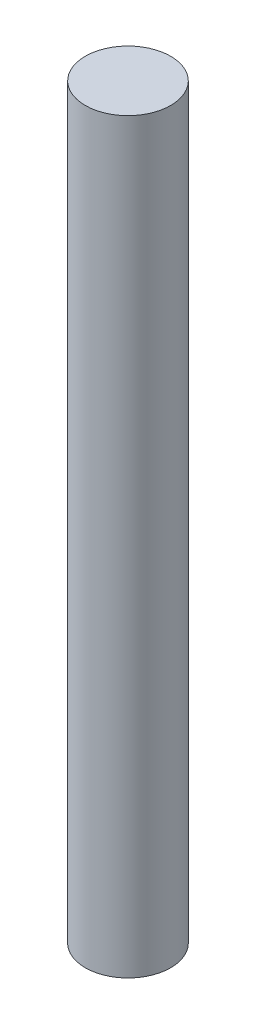
ISO-10303-21;
HEADER;
FILE_DESCRIPTION(('STEP AP214'),'2;1');
FILE_NAME('part.step','',(''),(''),'','','');
FILE_SCHEMA(('AUTOMOTIVE_DESIGN { 1 0 10303 214 1 1 1 1 }'));
ENDSEC;
DATA;
#1=APPLICATION_CONTEXT('core data for automotive mechanical design processes');
#2=APPLICATION_PROTOCOL_DEFINITION('international standard','automotive_design',2000,#1);
#3=PRODUCT_CONTEXT('',#1,'mechanical');
#4=PRODUCT('Part','Part','',(#3));
#5=PRODUCT_RELATED_PRODUCT_CATEGORY('part','',(#4));
#6=PRODUCT_DEFINITION_FORMATION('','',#4);
#7=PRODUCT_DEFINITION_CONTEXT('part definition',#1,'design');
#8=PRODUCT_DEFINITION('design','',#6,#7);
#9=PRODUCT_DEFINITION_SHAPE('','',#8);
#10=(LENGTH_UNIT() NAMED_UNIT(*) SI_UNIT(.MILLI.,.METRE.));
#11=(NAMED_UNIT(*) PLANE_ANGLE_UNIT() SI_UNIT($,.RADIAN.));
#12=(NAMED_UNIT(*) SI_UNIT($,.STERADIAN.) SOLID_ANGLE_UNIT());
#13=UNCERTAINTY_MEASURE_WITH_UNIT(LENGTH_MEASURE(1.E-05),#10,'distance_accuracy_value','');
#14=(GEOMETRIC_REPRESENTATION_CONTEXT(3) GLOBAL_UNCERTAINTY_ASSIGNED_CONTEXT((#13)) GLOBAL_UNIT_ASSIGNED_CONTEXT((#10,
#11,#12)) REPRESENTATION_CONTEXT('',''));
#15=CARTESIAN_POINT('',(0.,0.,0.));
#16=DIRECTION('',(0.,0.,1.));
#17=DIRECTION('',(1.,0.,0.));
#18=AXIS2_PLACEMENT_3D('',#15,#16,#17);
#19=CARTESIAN_POINT('',(0.,70.,0.));
#20=DIRECTION('',(0.,-1.,0.));
#21=DIRECTION('',(0.,0.,-1.));
#22=AXIS2_PLACEMENT_3D('',#19,#20,#21);
#23=CYLINDRICAL_SURFACE('',#22,4.);
#24=CARTESIAN_POINT('',(0.,70.,0.));
#25=DIRECTION('',(0.,1.,0.));
#26=DIRECTION('',(0.,0.,1.));
#27=AXIS2_PLACEMENT_3D('',#24,#25,#26);
#28=CIRCLE('',#27,4.);
#29=CARTESIAN_POINT('',(0.,70.,4.));
#30=VERTEX_POINT('',#29);
#31=EDGE_CURVE('E10',#30,#30,#28,.T.);
#32=ORIENTED_EDGE('',*,*,#31,.F.);
#33=EDGE_LOOP('',(#32));
#34=FACE_BOUND('',#33,.T.);
#35=CARTESIAN_POINT('',(0.,0.,0.));
#36=DIRECTION('',(0.,1.,0.));
#37=DIRECTION('',(0.,0.,1.));
#38=AXIS2_PLACEMENT_3D('',#35,#36,#37);
#39=CIRCLE('',#38,4.);
#40=CARTESIAN_POINT('',(0.,0.,4.));
#41=VERTEX_POINT('',#40);
#42=EDGE_CURVE('E39',#41,#41,#39,.T.);
#43=ORIENTED_EDGE('',*,*,#42,.T.);
#44=EDGE_LOOP('',(#43));
#45=FACE_BOUND('',#44,.T.);
#46=ADVANCED_FACE('F36',(#34,#45),#23,.T.);
#47=CARTESIAN_POINT('',(0.,70.,0.));
#48=DIRECTION('',(0.,1.,0.));
#49=DIRECTION('',(0.,0.,1.));
#50=AXIS2_PLACEMENT_3D('',#47,#48,#49);
#51=PLANE('',#50);
#52=ORIENTED_EDGE('',*,*,#31,.T.);
#53=EDGE_LOOP('',(#52));
#54=FACE_BOUND('',#53,.T.);
#55=ADVANCED_FACE('F51',(#54),#51,.T.);
#56=CARTESIAN_POINT('',(0.,0.,0.));
#57=DIRECTION('',(0.,1.,0.));
#58=DIRECTION('',(0.,0.,1.));
#59=AXIS2_PLACEMENT_3D('',#56,#57,#58);
#60=PLANE('',#59);
#61=ORIENTED_EDGE('',*,*,#42,.F.);
#62=EDGE_LOOP('',(#61));
#63=FACE_BOUND('',#62,.T.);
#64=ADVANCED_FACE('F49',(#63),#60,.F.);
#65=CLOSED_SHELL('',(#46,#55,#64));
#66=MANIFOLD_SOLID_BREP('B2',#65);
#67=ADVANCED_BREP_SHAPE_REPRESENTATION('',(#18,#66),#14);
#68=SHAPE_DEFINITION_REPRESENTATION(#9,#67);
ENDSEC;
END-ISO-10303-21;
